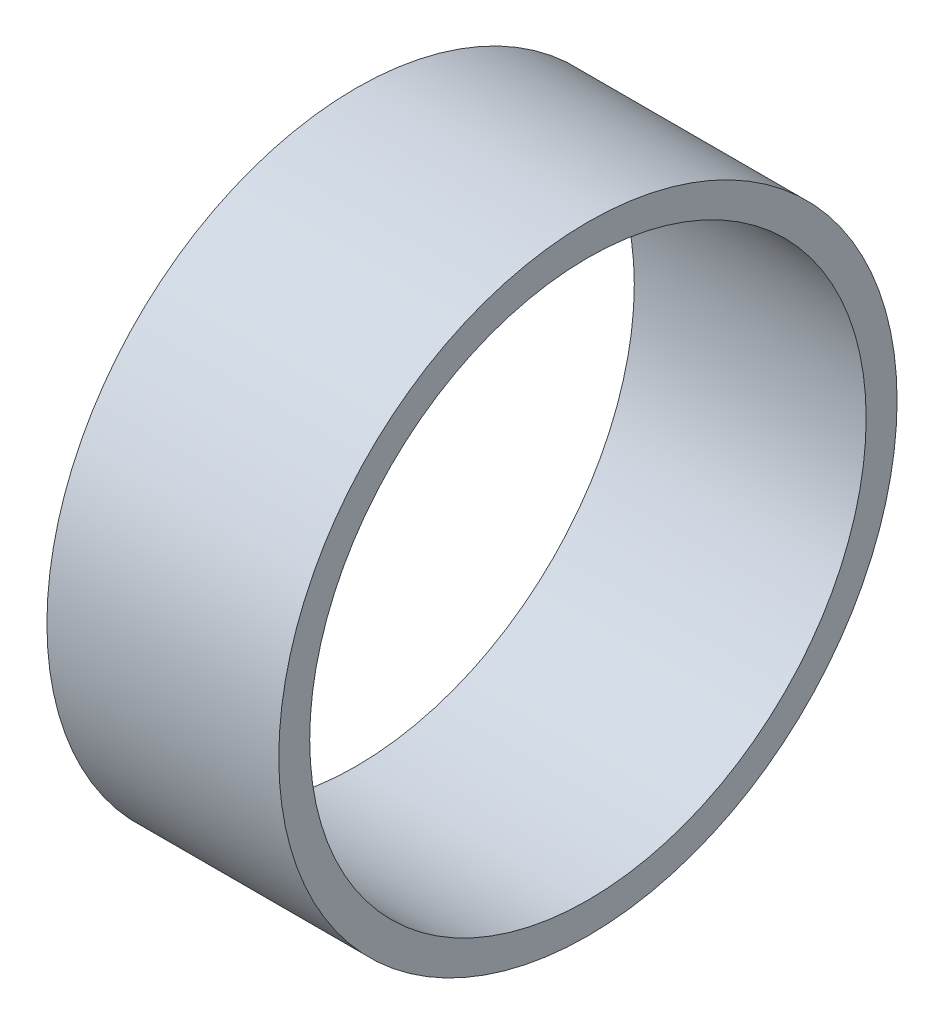
ISO-10303-21;
HEADER;
FILE_DESCRIPTION(('STEP AP214'),'2;1');
FILE_NAME('part.step','',(''),(''),'','','');
FILE_SCHEMA(('AUTOMOTIVE_DESIGN { 1 0 10303 214 1 1 1 1 }'));
ENDSEC;
DATA;
#1=APPLICATION_CONTEXT('core data for automotive mechanical design processes');
#2=APPLICATION_PROTOCOL_DEFINITION('international standard','automotive_design',2000,#1);
#3=PRODUCT_CONTEXT('',#1,'mechanical');
#4=PRODUCT('Part','Part','',(#3));
#5=PRODUCT_RELATED_PRODUCT_CATEGORY('part','',(#4));
#6=PRODUCT_DEFINITION_FORMATION('','',#4);
#7=PRODUCT_DEFINITION_CONTEXT('part definition',#1,'design');
#8=PRODUCT_DEFINITION('design','',#6,#7);
#9=PRODUCT_DEFINITION_SHAPE('','',#8);
#10=(LENGTH_UNIT() NAMED_UNIT(*) SI_UNIT(.MILLI.,.METRE.));
#11=(NAMED_UNIT(*) PLANE_ANGLE_UNIT() SI_UNIT($,.RADIAN.));
#12=(NAMED_UNIT(*) SI_UNIT($,.STERADIAN.) SOLID_ANGLE_UNIT());
#13=UNCERTAINTY_MEASURE_WITH_UNIT(LENGTH_MEASURE(1.E-05),#10,'distance_accuracy_value','');
#14=(GEOMETRIC_REPRESENTATION_CONTEXT(3) GLOBAL_UNCERTAINTY_ASSIGNED_CONTEXT((#13)) GLOBAL_UNIT_ASSIGNED_CONTEXT((#10,
#11,#12)) REPRESENTATION_CONTEXT('',''));
#15=CARTESIAN_POINT('',(0.,0.,0.));
#16=DIRECTION('',(0.,0.,1.));
#17=DIRECTION('',(1.,0.,0.));
#18=AXIS2_PLACEMENT_3D('',#15,#16,#17);
#19=CARTESIAN_POINT('',(0.,0.,0.));
#20=DIRECTION('',(1.,0.,0.));
#21=DIRECTION('',(0.,0.,-1.));
#22=AXIS2_PLACEMENT_3D('',#19,#20,#21);
#23=CYLINDRICAL_SURFACE('',#22,101.6);
#24=CARTESIAN_POINT('',(0.,0.,0.));
#25=DIRECTION('',(1.,0.,0.));
#26=DIRECTION('',(0.,0.,-1.));
#27=AXIS2_PLACEMENT_3D('',#24,#25,#26);
#28=CIRCLE('',#27,101.6);
#29=CARTESIAN_POINT('',(0.,0.,-101.6));
#30=VERTEX_POINT('',#29);
#31=EDGE_CURVE('E10',#30,#30,#28,.T.);
#32=CARTESIAN_POINT('',(76.2,0.,0.));
#33=DIRECTION('',(1.,0.,0.));
#34=DIRECTION('',(0.,0.,-1.));
#35=AXIS2_PLACEMENT_3D('',#32,#33,#34);
#36=CIRCLE('',#35,101.6);
#37=CARTESIAN_POINT('',(76.2,0.,-101.6));
#38=VERTEX_POINT('',#37);
#39=EDGE_CURVE('E40',#38,#38,#36,.T.);
#40=CARTESIAN_POINT('',(0.,0.,-101.6));
#41=CARTESIAN_POINT('',(0.79375,0.,-101.6));
#42=CARTESIAN_POINT('',(1.5875,0.,-101.6));
#43=CARTESIAN_POINT('',(3.175,0.,-101.6));
#44=CARTESIAN_POINT('',(3.96875,0.,-101.6));
#45=CARTESIAN_POINT('',(5.55625,0.,-101.6));
#46=CARTESIAN_POINT('',(6.35,0.,-101.6));
#47=CARTESIAN_POINT('',(7.9375,0.,-101.6));
#48=CARTESIAN_POINT('',(8.73125,0.,-101.6));
#49=CARTESIAN_POINT('',(10.31875,0.,-101.6));
#50=CARTESIAN_POINT('',(11.1125,0.,-101.6));
#51=CARTESIAN_POINT('',(12.7,0.,-101.6));
#52=CARTESIAN_POINT('',(13.49375,0.,-101.6));
#53=CARTESIAN_POINT('',(15.08125,0.,-101.6));
#54=CARTESIAN_POINT('',(15.875,0.,-101.6));
#55=CARTESIAN_POINT('',(17.4625,0.,-101.6));
#56=CARTESIAN_POINT('',(18.25625,0.,-101.6));
#57=CARTESIAN_POINT('',(19.84375,0.,-101.6));
#58=CARTESIAN_POINT('',(20.6375,0.,-101.6));
#59=CARTESIAN_POINT('',(22.225,0.,-101.6));
#60=CARTESIAN_POINT('',(23.01875,0.,-101.6));
#61=CARTESIAN_POINT('',(24.60625,0.,-101.6));
#62=CARTESIAN_POINT('',(25.4,0.,-101.6));
#63=CARTESIAN_POINT('',(26.9875,0.,-101.6));
#64=CARTESIAN_POINT('',(27.78125,0.,-101.6));
#65=CARTESIAN_POINT('',(29.36875,0.,-101.6));
#66=CARTESIAN_POINT('',(30.1625,0.,-101.6));
#67=CARTESIAN_POINT('',(31.75,0.,-101.6));
#68=CARTESIAN_POINT('',(32.54375,0.,-101.6));
#69=CARTESIAN_POINT('',(34.13125,0.,-101.6));
#70=CARTESIAN_POINT('',(34.925,0.,-101.6));
#71=CARTESIAN_POINT('',(36.5125,0.,-101.6));
#72=CARTESIAN_POINT('',(37.30625,0.,-101.6));
#73=CARTESIAN_POINT('',(38.89375,0.,-101.6));
#74=CARTESIAN_POINT('',(39.6875,0.,-101.6));
#75=CARTESIAN_POINT('',(41.275,0.,-101.6));
#76=CARTESIAN_POINT('',(42.06875,0.,-101.6));
#77=CARTESIAN_POINT('',(43.65625,0.,-101.6));
#78=CARTESIAN_POINT('',(44.45,0.,-101.6));
#79=CARTESIAN_POINT('',(46.0375,0.,-101.6));
#80=CARTESIAN_POINT('',(46.83125,0.,-101.6));
#81=CARTESIAN_POINT('',(48.41875,0.,-101.6));
#82=CARTESIAN_POINT('',(49.2125,0.,-101.6));
#83=CARTESIAN_POINT('',(50.8,0.,-101.6));
#84=CARTESIAN_POINT('',(51.59375,0.,-101.6));
#85=CARTESIAN_POINT('',(53.18125,0.,-101.6));
#86=CARTESIAN_POINT('',(53.975,0.,-101.6));
#87=CARTESIAN_POINT('',(55.5625,0.,-101.6));
#88=CARTESIAN_POINT('',(56.35625,0.,-101.6));
#89=CARTESIAN_POINT('',(57.94375,0.,-101.6));
#90=CARTESIAN_POINT('',(58.7375,0.,-101.6));
#91=CARTESIAN_POINT('',(60.325,0.,-101.6));
#92=CARTESIAN_POINT('',(61.11875,0.,-101.6));
#93=CARTESIAN_POINT('',(62.70625,0.,-101.6));
#94=CARTESIAN_POINT('',(63.5,0.,-101.6));
#95=CARTESIAN_POINT('',(65.0875,0.,-101.6));
#96=CARTESIAN_POINT('',(65.88125,0.,-101.6));
#97=CARTESIAN_POINT('',(67.46875,0.,-101.6));
#98=CARTESIAN_POINT('',(68.2625,0.,-101.6));
#99=CARTESIAN_POINT('',(69.85,0.,-101.6));
#100=CARTESIAN_POINT('',(70.64375,0.,-101.6));
#101=CARTESIAN_POINT('',(72.23125,0.,-101.6));
#102=CARTESIAN_POINT('',(73.025,0.,-101.6));
#103=CARTESIAN_POINT('',(74.6125,0.,-101.6));
#104=CARTESIAN_POINT('',(75.40625,0.,-101.6));
#105=CARTESIAN_POINT('',(76.2,0.,-101.6));
#106=B_SPLINE_CURVE_WITH_KNOTS('',3,(#40,#41,#42,#43,#44,#45,#46,#47,#48,#49,#50,#51,#52,#53,
#54,#55,#56,#57,#58,#59,#60,#61,#62,#63,#64,#65,#66,#67,#68,#69,#70,#71,#72,#73,#74,#75,#76,#77,
#78,#79,#80,#81,#82,#83,#84,#85,#86,#87,#88,#89,#90,#91,#92,#93,#94,#95,#96,#97,#98,#99,#100,
#101,#102,#103,#104,#105),.UNSPECIFIED.,.F.,.F.,(4,2,2,2,2,2,2,2,2,2,2,2,2,2,2,2,2,2,2,2,2,2,2,
2,2,2,2,2,2,2,2,2,4),(0.,2.38125,4.7625,7.14375,9.525,11.90625,14.2875,16.66875,19.05,21.43125,
23.8125,26.19375,28.575,30.95625,33.3375,35.71875,38.1,40.48125,42.8625,45.24375,47.625,
50.00625,52.3875,54.76875,57.15,59.53125,61.9125,64.29375,66.675,69.05625,71.4375,73.81875,
76.2),.UNSPECIFIED.);
#107=EDGE_CURVE('BSEAM37',#30,#38,#106,.T.);
#108=ORIENTED_EDGE('',*,*,#31,.T.);
#109=ORIENTED_EDGE('',*,*,#39,.F.);
#110=ORIENTED_EDGE('',*,*,#107,.T.);
#111=ORIENTED_EDGE('',*,*,#107,.F.);
#112=EDGE_LOOP('',(#108,#110,#109,#111));
#113=FACE_BOUND('',#112,.T.);
#114=ADVANCED_FACE('F37',(#113),#23,.T.);
#115=CARTESIAN_POINT('',(0.,0.,0.));
#116=DIRECTION('',(1.,0.,0.));
#117=DIRECTION('',(0.,0.,-1.));
#118=AXIS2_PLACEMENT_3D('',#115,#116,#117);
#119=PLANE('',#118);
#120=CARTESIAN_POINT('',(0.,0.,0.));
#121=DIRECTION('',(1.,0.,0.));
#122=DIRECTION('',(0.,0.,-1.));
#123=AXIS2_PLACEMENT_3D('',#120,#121,#122);
#124=CIRCLE('',#123,91.44);
#125=CARTESIAN_POINT('',(0.,0.,-91.44));
#126=VERTEX_POINT('',#125);
#127=EDGE_CURVE('E47',#126,#126,#124,.T.);
#128=ORIENTED_EDGE('',*,*,#127,.T.);
#129=EDGE_LOOP('',(#128));
#130=FACE_BOUND('',#129,.T.);
#131=ORIENTED_EDGE('',*,*,#31,.F.);
#132=EDGE_LOOP('',(#131));
#133=FACE_BOUND('',#132,.T.);
#134=ADVANCED_FACE('F55',(#130,#133),#119,.F.);
#135=CARTESIAN_POINT('',(76.2,0.,0.));
#136=DIRECTION('',(1.,0.,0.));
#137=DIRECTION('',(0.,0.,-1.));
#138=AXIS2_PLACEMENT_3D('',#135,#136,#137);
#139=PLANE('',#138);
#140=CARTESIAN_POINT('',(76.2,0.,0.));
#141=DIRECTION('',(1.,0.,0.));
#142=DIRECTION('',(0.,0.,-1.));
#143=AXIS2_PLACEMENT_3D('',#140,#141,#142);
#144=CIRCLE('',#143,91.44);
#145=CARTESIAN_POINT('',(76.2,0.,-91.44));
#146=VERTEX_POINT('',#145);
#147=EDGE_CURVE('E49',#146,#146,#144,.T.);
#148=ORIENTED_EDGE('',*,*,#147,.F.);
#149=EDGE_LOOP('',(#148));
#150=FACE_BOUND('',#149,.T.);
#151=ORIENTED_EDGE('',*,*,#39,.T.);
#152=EDGE_LOOP('',(#151));
#153=FACE_BOUND('',#152,.T.);
#154=ADVANCED_FACE('F61',(#150,#153),#139,.T.);
#155=CARTESIAN_POINT('',(0.,0.,0.));
#156=DIRECTION('',(1.,0.,0.));
#157=DIRECTION('',(0.,0.,-1.));
#158=AXIS2_PLACEMENT_3D('',#155,#156,#157);
#159=CYLINDRICAL_SURFACE('',#158,91.44);
#160=CARTESIAN_POINT('',(0.,0.,-91.44));
#161=CARTESIAN_POINT('',(0.79375,0.,-91.44));
#162=CARTESIAN_POINT('',(1.5875,0.,-91.44));
#163=CARTESIAN_POINT('',(3.175,0.,-91.44));
#164=CARTESIAN_POINT('',(3.96875,0.,-91.44));
#165=CARTESIAN_POINT('',(5.55625,0.,-91.44));
#166=CARTESIAN_POINT('',(6.35,0.,-91.44));
#167=CARTESIAN_POINT('',(7.9375,0.,-91.44));
#168=CARTESIAN_POINT('',(8.73125,0.,-91.44));
#169=CARTESIAN_POINT('',(10.31875,0.,-91.44));
#170=CARTESIAN_POINT('',(11.1125,0.,-91.44));
#171=CARTESIAN_POINT('',(12.7,0.,-91.44));
#172=CARTESIAN_POINT('',(13.49375,0.,-91.44));
#173=CARTESIAN_POINT('',(15.08125,0.,-91.44));
#174=CARTESIAN_POINT('',(15.875,0.,-91.44));
#175=CARTESIAN_POINT('',(17.4625,0.,-91.44));
#176=CARTESIAN_POINT('',(18.25625,0.,-91.44));
#177=CARTESIAN_POINT('',(19.84375,0.,-91.44));
#178=CARTESIAN_POINT('',(20.6375,0.,-91.44));
#179=CARTESIAN_POINT('',(22.225,0.,-91.44));
#180=CARTESIAN_POINT('',(23.01875,0.,-91.44));
#181=CARTESIAN_POINT('',(24.60625,0.,-91.44));
#182=CARTESIAN_POINT('',(25.4,0.,-91.44));
#183=CARTESIAN_POINT('',(26.9875,0.,-91.44));
#184=CARTESIAN_POINT('',(27.78125,0.,-91.44));
#185=CARTESIAN_POINT('',(29.36875,0.,-91.44));
#186=CARTESIAN_POINT('',(30.1625,0.,-91.44));
#187=CARTESIAN_POINT('',(31.75,0.,-91.44));
#188=CARTESIAN_POINT('',(32.54375,0.,-91.44));
#189=CARTESIAN_POINT('',(34.13125,0.,-91.44));
#190=CARTESIAN_POINT('',(34.925,0.,-91.44));
#191=CARTESIAN_POINT('',(36.5125,0.,-91.44));
#192=CARTESIAN_POINT('',(37.30625,0.,-91.44));
#193=CARTESIAN_POINT('',(38.89375,0.,-91.44));
#194=CARTESIAN_POINT('',(39.6875,0.,-91.44));
#195=CARTESIAN_POINT('',(41.275,0.,-91.44));
#196=CARTESIAN_POINT('',(42.06875,0.,-91.44));
#197=CARTESIAN_POINT('',(43.65625,0.,-91.44));
#198=CARTESIAN_POINT('',(44.45,0.,-91.44));
#199=CARTESIAN_POINT('',(46.0375,0.,-91.44));
#200=CARTESIAN_POINT('',(46.83125,0.,-91.44));
#201=CARTESIAN_POINT('',(48.41875,0.,-91.44));
#202=CARTESIAN_POINT('',(49.2125,0.,-91.44));
#203=CARTESIAN_POINT('',(50.8,0.,-91.44));
#204=CARTESIAN_POINT('',(51.59375,0.,-91.44));
#205=CARTESIAN_POINT('',(53.18125,0.,-91.44));
#206=CARTESIAN_POINT('',(53.975,0.,-91.44));
#207=CARTESIAN_POINT('',(55.5625,0.,-91.44));
#208=CARTESIAN_POINT('',(56.35625,0.,-91.44));
#209=CARTESIAN_POINT('',(57.94375,0.,-91.44));
#210=CARTESIAN_POINT('',(58.7375,0.,-91.44));
#211=CARTESIAN_POINT('',(60.325,0.,-91.44));
#212=CARTESIAN_POINT('',(61.11875,0.,-91.44));
#213=CARTESIAN_POINT('',(62.70625,0.,-91.44));
#214=CARTESIAN_POINT('',(63.5,0.,-91.44));
#215=CARTESIAN_POINT('',(65.0875,0.,-91.44));
#216=CARTESIAN_POINT('',(65.88125,0.,-91.44));
#217=CARTESIAN_POINT('',(67.46875,0.,-91.44));
#218=CARTESIAN_POINT('',(68.2625,0.,-91.44));
#219=CARTESIAN_POINT('',(69.85,0.,-91.44));
#220=CARTESIAN_POINT('',(70.64375,0.,-91.44));
#221=CARTESIAN_POINT('',(72.23125,0.,-91.44));
#222=CARTESIAN_POINT('',(73.025,0.,-91.44));
#223=CARTESIAN_POINT('',(74.6125,0.,-91.44));
#224=CARTESIAN_POINT('',(75.40625,0.,-91.44));
#225=CARTESIAN_POINT('',(76.2,0.,-91.44));
#226=B_SPLINE_CURVE_WITH_KNOTS('',3,(#160,#161,#162,#163,#164,#165,#166,#167,#168,#169,#170,
#171,#172,#173,#174,#175,#176,#177,#178,#179,#180,#181,#182,#183,#184,#185,#186,#187,#188,#189,
#190,#191,#192,#193,#194,#195,#196,#197,#198,#199,#200,#201,#202,#203,#204,#205,#206,#207,#208,
#209,#210,#211,#212,#213,#214,#215,#216,#217,#218,#219,#220,#221,#222,#223,#224,#225),
.UNSPECIFIED.,.F.,.F.,(4,2,2,2,2,2,2,2,2,2,2,2,2,2,2,2,2,2,2,2,2,2,2,2,2,2,2,2,2,2,2,2,4),(0.,
2.38125,4.7625,7.14375,9.525,11.90625,14.2875,16.66875,19.05,21.43125,23.8125,26.19375,28.575,
30.95625,33.3375,35.71875,38.1,40.48125,42.8625,45.24375,47.625,50.00625,52.3875,54.76875,57.15,
59.53125,61.9125,64.29375,66.675,69.05625,71.4375,73.81875,76.2),.UNSPECIFIED.);
#227=EDGE_CURVE('BSEAM58',#126,#146,#226,.T.);
#228=ORIENTED_EDGE('',*,*,#127,.F.);
#229=ORIENTED_EDGE('',*,*,#147,.T.);
#230=ORIENTED_EDGE('',*,*,#227,.T.);
#231=ORIENTED_EDGE('',*,*,#227,.F.);
#232=EDGE_LOOP('',(#228,#230,#229,#231));
#233=FACE_BOUND('',#232,.T.);
#234=ADVANCED_FACE('F58',(#233),#159,.F.);
#235=CLOSED_SHELL('',(#114,#134,#154,#234));
#236=MANIFOLD_SOLID_BREP('B2',#235);
#237=ADVANCED_BREP_SHAPE_REPRESENTATION('',(#18,#236),#14);
#238=SHAPE_DEFINITION_REPRESENTATION(#9,#237);
ENDSEC;
END-ISO-10303-21;
